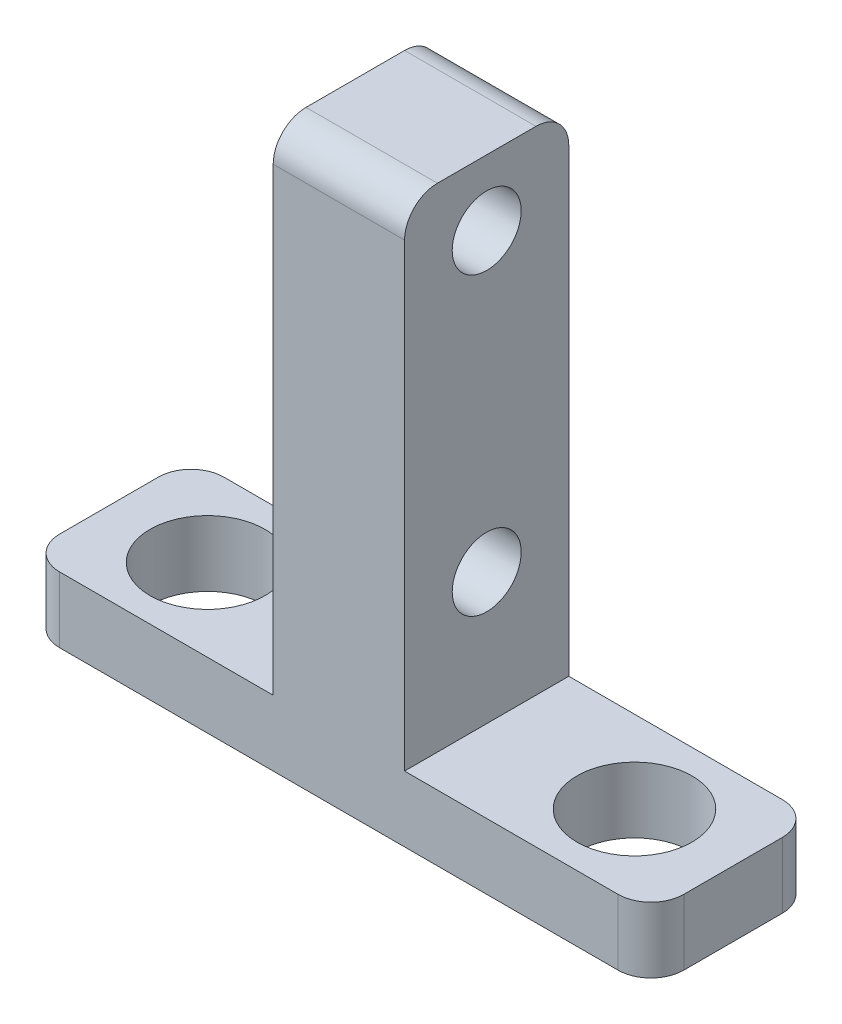
ISO-10303-21;
HEADER;
FILE_DESCRIPTION(('STEP AP214'),'2;1');
FILE_NAME('part.step','',(''),(''),'','','');
FILE_SCHEMA(('AUTOMOTIVE_DESIGN { 1 0 10303 214 1 1 1 1 }'));
ENDSEC;
DATA;
#1=APPLICATION_CONTEXT('core data for automotive mechanical design processes');
#2=APPLICATION_PROTOCOL_DEFINITION('international standard','automotive_design',2000,#1);
#3=PRODUCT_CONTEXT('',#1,'mechanical');
#4=PRODUCT('Part','Part','',(#3));
#5=PRODUCT_RELATED_PRODUCT_CATEGORY('part','',(#4));
#6=PRODUCT_DEFINITION_FORMATION('','',#4);
#7=PRODUCT_DEFINITION_CONTEXT('part definition',#1,'design');
#8=PRODUCT_DEFINITION('design','',#6,#7);
#9=PRODUCT_DEFINITION_SHAPE('','',#8);
#10=(LENGTH_UNIT() NAMED_UNIT(*) SI_UNIT(.MILLI.,.METRE.));
#11=(NAMED_UNIT(*) PLANE_ANGLE_UNIT() SI_UNIT($,.RADIAN.));
#12=(NAMED_UNIT(*) SI_UNIT($,.STERADIAN.) SOLID_ANGLE_UNIT());
#13=UNCERTAINTY_MEASURE_WITH_UNIT(LENGTH_MEASURE(1.E-05),#10,'distance_accuracy_value','');
#14=(GEOMETRIC_REPRESENTATION_CONTEXT(3) GLOBAL_UNCERTAINTY_ASSIGNED_CONTEXT((#13)) GLOBAL_UNIT_ASSIGNED_CONTEXT((#10,
#11,#12)) REPRESENTATION_CONTEXT('',''));
#15=CARTESIAN_POINT('',(0.,0.,0.));
#16=DIRECTION('',(0.,0.,1.));
#17=DIRECTION('',(1.,0.,0.));
#18=AXIS2_PLACEMENT_3D('',#15,#16,#17);
#19=CARTESIAN_POINT('',(0.,2.,0.));
#20=DIRECTION('',(0.,1.,0.));
#21=DIRECTION('',(0.,0.,1.));
#22=AXIS2_PLACEMENT_3D('',#19,#20,#21);
#23=PLANE('',#22);
#24=CARTESIAN_POINT('',(13.,2.,2.5));
#25=DIRECTION('',(0.,1.,0.));
#26=DIRECTION('',(0.,0.,1.));
#27=AXIS2_PLACEMENT_3D('',#24,#25,#26);
#28=CIRCLE('',#27,1.75);
#29=CARTESIAN_POINT('',(13.,2.,4.25));
#30=VERTEX_POINT('',#29);
#31=EDGE_CURVE('E307',#30,#30,#28,.T.);
#32=ORIENTED_EDGE('',*,*,#31,.F.);
#33=EDGE_LOOP('',(#32));
#34=FACE_BOUND('',#33,.T.);
#35=DIRECTION('',(1.,0.,0.));
#36=VECTOR('',#35,1.);
#37=CARTESIAN_POINT('',(-3.,2.,5.));
#38=LINE('',#37,#36);
#39=CARTESIAN_POINT('',(8.5,2.,5.));
#40=VERTEX_POINT('',#39);
#41=CARTESIAN_POINT('',(15.,2.,5.));
#42=VERTEX_POINT('',#41);
#43=EDGE_CURVE('E158',#40,#42,#38,.T.);
#44=ORIENTED_EDGE('',*,*,#43,.T.);
#45=CARTESIAN_POINT('',(15.,2.,4.));
#46=DIRECTION('',(0.,1.,0.));
#47=DIRECTION('',(0.,0.,1.));
#48=AXIS2_PLACEMENT_3D('',#45,#46,#47);
#49=CIRCLE('',#48,1.);
#50=CARTESIAN_POINT('',(16.,2.,4.));
#51=VERTEX_POINT('',#50);
#52=EDGE_CURVE('E237',#42,#51,#49,.T.);
#53=ORIENTED_EDGE('',*,*,#52,.T.);
#54=DIRECTION('',(0.,0.,-1.));
#55=VECTOR('',#54,1.);
#56=CARTESIAN_POINT('',(16.,2.,0.));
#57=LINE('',#56,#55);
#58=CARTESIAN_POINT('',(16.,2.,1.));
#59=VERTEX_POINT('',#58);
#60=EDGE_CURVE('E157',#51,#59,#57,.T.);
#61=ORIENTED_EDGE('',*,*,#60,.T.);
#62=CARTESIAN_POINT('',(15.,2.,1.));
#63=DIRECTION('',(0.,1.,0.));
#64=DIRECTION('',(0.,0.,1.));
#65=AXIS2_PLACEMENT_3D('',#62,#63,#64);
#66=CIRCLE('',#65,1.);
#67=CARTESIAN_POINT('',(15.,2.,0.));
#68=VERTEX_POINT('',#67);
#69=EDGE_CURVE('E235',#59,#68,#66,.T.);
#70=ORIENTED_EDGE('',*,*,#69,.T.);
#71=DIRECTION('',(-1.,0.,0.));
#72=VECTOR('',#71,1.);
#73=CARTESIAN_POINT('',(0.,2.,0.));
#74=LINE('',#73,#72);
#75=CARTESIAN_POINT('',(8.5,2.,0.));
#76=VERTEX_POINT('',#75);
#77=EDGE_CURVE('E178',#68,#76,#74,.T.);
#78=ORIENTED_EDGE('',*,*,#77,.T.);
#79=DIRECTION('',(0.,0.,-1.));
#80=VECTOR('',#79,1.);
#81=CARTESIAN_POINT('',(8.5,2.,0.));
#82=LINE('',#81,#80);
#83=EDGE_CURVE('E163',#40,#76,#82,.T.);
#84=ORIENTED_EDGE('',*,*,#83,.F.);
#85=EDGE_LOOP('',(#44,#53,#61,#70,#78,#84));
#86=FACE_BOUND('',#85,.T.);
#87=ADVANCED_FACE('F34',(#34,#86),#23,.T.);
#88=CARTESIAN_POINT('',(-3.,2.,0.));
#89=DIRECTION('',(1.,0.,0.));
#90=DIRECTION('',(0.,0.,-1.));
#91=AXIS2_PLACEMENT_3D('',#88,#89,#90);
#92=PLANE('',#91);
#93=DIRECTION('',(0.,0.,1.));
#94=VECTOR('',#93,1.);
#95=CARTESIAN_POINT('',(-3.,2.,0.));
#96=LINE('',#95,#94);
#97=CARTESIAN_POINT('',(-3.,2.,1.));
#98=VERTEX_POINT('',#97);
#99=CARTESIAN_POINT('',(-3.,2.,4.));
#100=VERTEX_POINT('',#99);
#101=EDGE_CURVE('E181',#98,#100,#96,.T.);
#102=ORIENTED_EDGE('',*,*,#101,.F.);
#103=DIRECTION('',(0.,-1.,0.));
#104=VECTOR('',#103,1.);
#105=CARTESIAN_POINT('',(-3.,2.,1.));
#106=LINE('',#105,#104);
#107=CARTESIAN_POINT('',(-3.,0.,1.));
#108=VERTEX_POINT('',#107);
#109=EDGE_CURVE('E207',#98,#108,#106,.T.);
#110=ORIENTED_EDGE('',*,*,#109,.T.);
#111=DIRECTION('',(0.,0.,1.));
#112=VECTOR('',#111,1.);
#113=CARTESIAN_POINT('',(-3.,0.,0.));
#114=LINE('',#113,#112);
#115=CARTESIAN_POINT('',(-3.,0.,4.));
#116=VERTEX_POINT('',#115);
#117=EDGE_CURVE('E177',#108,#116,#114,.T.);
#118=ORIENTED_EDGE('',*,*,#117,.T.);
#119=DIRECTION('',(0.,-1.,0.));
#120=VECTOR('',#119,1.);
#121=CARTESIAN_POINT('',(-3.,2.,4.));
#122=LINE('',#121,#120);
#123=EDGE_CURVE('E186',#116,#100,#122,.F.);
#124=ORIENTED_EDGE('',*,*,#123,.T.);
#125=EDGE_LOOP('',(#102,#110,#118,#124));
#126=FACE_BOUND('',#125,.T.);
#127=ADVANCED_FACE('F268',(#126),#92,.F.);
#128=CARTESIAN_POINT('',(16.,2.,5.));
#129=DIRECTION('',(0.,0.,-1.));
#130=DIRECTION('',(-1.,0.,0.));
#131=AXIS2_PLACEMENT_3D('',#128,#129,#130);
#132=PLANE('',#131);
#133=DIRECTION('',(0.,-1.,0.));
#134=VECTOR('',#133,1.);
#135=CARTESIAN_POINT('',(8.5,17.,5.));
#136=LINE('',#135,#134);
#137=CARTESIAN_POINT('',(8.5,16.,5.));
#138=VERTEX_POINT('',#137);
#139=EDGE_CURVE('E146',#138,#40,#136,.T.);
#140=ORIENTED_EDGE('',*,*,#139,.F.);
#141=DIRECTION('',(1.,0.,0.));
#142=VECTOR('',#141,1.);
#143=CARTESIAN_POINT('',(4.5,16.,5.));
#144=LINE('',#143,#142);
#145=CARTESIAN_POINT('',(4.5,16.,5.));
#146=VERTEX_POINT('',#145);
#147=EDGE_CURVE('E11',#138,#146,#144,.F.);
#148=ORIENTED_EDGE('',*,*,#147,.T.);
#149=DIRECTION('',(0.,-1.,0.));
#150=VECTOR('',#149,1.);
#151=CARTESIAN_POINT('',(4.5,17.,5.));
#152=LINE('',#151,#150);
#153=CARTESIAN_POINT('',(4.5,2.,5.));
#154=VERTEX_POINT('',#153);
#155=EDGE_CURVE('E135',#146,#154,#152,.T.);
#156=ORIENTED_EDGE('',*,*,#155,.T.);
#157=CARTESIAN_POINT('',(-2.,2.,5.));
#158=VERTEX_POINT('',#157);
#159=EDGE_CURVE('E139',#158,#154,#38,.T.);
#160=ORIENTED_EDGE('',*,*,#159,.F.);
#161=DIRECTION('',(0.,-1.,0.));
#162=VECTOR('',#161,1.);
#163=CARTESIAN_POINT('',(-2.,2.,5.));
#164=LINE('',#163,#162);
#165=CARTESIAN_POINT('',(-2.,0.,5.));
#166=VERTEX_POINT('',#165);
#167=EDGE_CURVE('E228',#158,#166,#164,.T.);
#168=ORIENTED_EDGE('',*,*,#167,.T.);
#169=DIRECTION('',(1.,0.,0.));
#170=VECTOR('',#169,1.);
#171=CARTESIAN_POINT('',(16.,0.,5.));
#172=LINE('',#171,#170);
#173=CARTESIAN_POINT('',(15.,0.,5.));
#174=VERTEX_POINT('',#173);
#175=EDGE_CURVE('E189',#166,#174,#172,.T.);
#176=ORIENTED_EDGE('',*,*,#175,.T.);
#177=DIRECTION('',(0.,-1.,0.));
#178=VECTOR('',#177,1.);
#179=CARTESIAN_POINT('',(15.,2.,5.));
#180=LINE('',#179,#178);
#181=EDGE_CURVE('E226',#174,#42,#180,.F.);
#182=ORIENTED_EDGE('',*,*,#181,.T.);
#183=ORIENTED_EDGE('',*,*,#43,.F.);
#184=EDGE_LOOP('',(#140,#148,#156,#160,#168,#176,#182,#183));
#185=FACE_BOUND('',#184,.T.);
#186=ADVANCED_FACE('F137',(#185),#132,.F.);
#187=CARTESIAN_POINT('',(16.,2.,0.));
#188=DIRECTION('',(-1.,0.,0.));
#189=DIRECTION('',(0.,0.,1.));
#190=AXIS2_PLACEMENT_3D('',#187,#188,#189);
#191=PLANE('',#190);
#192=ORIENTED_EDGE('',*,*,#60,.F.);
#193=DIRECTION('',(0.,-1.,0.));
#194=VECTOR('',#193,1.);
#195=CARTESIAN_POINT('',(16.,2.,4.));
#196=LINE('',#195,#194);
#197=CARTESIAN_POINT('',(16.,0.,4.));
#198=VERTEX_POINT('',#197);
#199=EDGE_CURVE('E232',#51,#198,#196,.T.);
#200=ORIENTED_EDGE('',*,*,#199,.T.);
#201=DIRECTION('',(0.,0.,-1.));
#202=VECTOR('',#201,1.);
#203=CARTESIAN_POINT('',(16.,0.,0.));
#204=LINE('',#203,#202);
#205=CARTESIAN_POINT('',(16.,0.,1.));
#206=VERTEX_POINT('',#205);
#207=EDGE_CURVE('E192',#198,#206,#204,.T.);
#208=ORIENTED_EDGE('',*,*,#207,.T.);
#209=DIRECTION('',(0.,-1.,0.));
#210=VECTOR('',#209,1.);
#211=CARTESIAN_POINT('',(16.,2.,1.));
#212=LINE('',#211,#210);
#213=EDGE_CURVE('E230',#206,#59,#212,.F.);
#214=ORIENTED_EDGE('',*,*,#213,.T.);
#215=EDGE_LOOP('',(#192,#200,#208,#214));
#216=FACE_BOUND('',#215,.T.);
#217=ADVANCED_FACE('F288',(#216),#191,.F.);
#218=CARTESIAN_POINT('',(13.,2.,0.));
#219=DIRECTION('',(0.,0.,1.));
#220=DIRECTION('',(1.,0.,0.));
#221=AXIS2_PLACEMENT_3D('',#218,#219,#220);
#222=PLANE('',#221);
#223=DIRECTION('',(0.,-1.,0.));
#224=VECTOR('',#223,1.);
#225=CARTESIAN_POINT('',(4.5,17.,0.));
#226=LINE('',#225,#224);
#227=CARTESIAN_POINT('',(4.5,16.,0.));
#228=VERTEX_POINT('',#227);
#229=CARTESIAN_POINT('',(4.5,2.,0.));
#230=VERTEX_POINT('',#229);
#231=EDGE_CURVE('E145',#228,#230,#226,.T.);
#232=ORIENTED_EDGE('',*,*,#231,.F.);
#233=DIRECTION('',(-1.,0.,0.));
#234=VECTOR('',#233,1.);
#235=CARTESIAN_POINT('',(8.5,16.,0.));
#236=LINE('',#235,#234);
#237=CARTESIAN_POINT('',(8.5,16.,0.));
#238=VERTEX_POINT('',#237);
#239=EDGE_CURVE('E57',#228,#238,#236,.F.);
#240=ORIENTED_EDGE('',*,*,#239,.T.);
#241=DIRECTION('',(0.,-1.,0.));
#242=VECTOR('',#241,1.);
#243=CARTESIAN_POINT('',(8.5,17.,0.));
#244=LINE('',#243,#242);
#245=EDGE_CURVE('E175',#238,#76,#244,.T.);
#246=ORIENTED_EDGE('',*,*,#245,.T.);
#247=ORIENTED_EDGE('',*,*,#77,.F.);
#248=DIRECTION('',(0.,-1.,0.));
#249=VECTOR('',#248,1.);
#250=CARTESIAN_POINT('',(15.,2.,0.));
#251=LINE('',#250,#249);
#252=CARTESIAN_POINT('',(15.,0.,0.));
#253=VERTEX_POINT('',#252);
#254=EDGE_CURVE('E218',#68,#253,#251,.T.);
#255=ORIENTED_EDGE('',*,*,#254,.T.);
#256=DIRECTION('',(-1.,0.,0.));
#257=VECTOR('',#256,1.);
#258=CARTESIAN_POINT('',(13.,0.,0.));
#259=LINE('',#258,#257);
#260=CARTESIAN_POINT('',(-2.,0.,0.));
#261=VERTEX_POINT('',#260);
#262=EDGE_CURVE('E195',#253,#261,#259,.T.);
#263=ORIENTED_EDGE('',*,*,#262,.T.);
#264=DIRECTION('',(0.,-1.,0.));
#265=VECTOR('',#264,1.);
#266=CARTESIAN_POINT('',(-2.,2.,0.));
#267=LINE('',#266,#265);
#268=CARTESIAN_POINT('',(-2.,2.,0.));
#269=VERTEX_POINT('',#268);
#270=EDGE_CURVE('E221',#261,#269,#267,.F.);
#271=ORIENTED_EDGE('',*,*,#270,.T.);
#272=EDGE_CURVE('E182',#230,#269,#74,.T.);
#273=ORIENTED_EDGE('',*,*,#272,.F.);
#274=EDGE_LOOP('',(#232,#240,#246,#247,#255,#263,#271,#273));
#275=FACE_BOUND('',#274,.T.);
#276=ADVANCED_FACE('F259',(#275),#222,.F.);
#277=CARTESIAN_POINT('',(0.,2.,2.5));
#278=DIRECTION('',(0.,1.,0.));
#279=DIRECTION('',(0.,0.,1.));
#280=AXIS2_PLACEMENT_3D('',#277,#278,#279);
#281=CIRCLE('',#280,1.75);
#282=CARTESIAN_POINT('',(0.,2.,4.25));
#283=VERTEX_POINT('',#282);
#284=EDGE_CURVE('E202',#283,#283,#281,.T.);
#285=ORIENTED_EDGE('',*,*,#284,.F.);
#286=EDGE_LOOP('',(#285));
#287=FACE_BOUND('',#286,.T.);
#288=ORIENTED_EDGE('',*,*,#272,.T.);
#289=CARTESIAN_POINT('',(-2.,2.,1.));
#290=DIRECTION('',(0.,1.,0.));
#291=DIRECTION('',(0.,0.,1.));
#292=AXIS2_PLACEMENT_3D('',#289,#290,#291);
#293=CIRCLE('',#292,1.);
#294=EDGE_CURVE('E224',#269,#98,#293,.T.);
#295=ORIENTED_EDGE('',*,*,#294,.T.);
#296=ORIENTED_EDGE('',*,*,#101,.T.);
#297=CARTESIAN_POINT('',(-2.,2.,4.));
#298=DIRECTION('',(0.,1.,0.));
#299=DIRECTION('',(0.,0.,1.));
#300=AXIS2_PLACEMENT_3D('',#297,#298,#299);
#301=CIRCLE('',#300,1.);
#302=EDGE_CURVE('E156',#100,#158,#301,.T.);
#303=ORIENTED_EDGE('',*,*,#302,.T.);
#304=ORIENTED_EDGE('',*,*,#159,.T.);
#305=DIRECTION('',(0.,0.,1.));
#306=VECTOR('',#305,1.);
#307=CARTESIAN_POINT('',(4.5,2.,0.));
#308=LINE('',#307,#306);
#309=EDGE_CURVE('E152',#230,#154,#308,.T.);
#310=ORIENTED_EDGE('',*,*,#309,.F.);
#311=EDGE_LOOP('',(#288,#295,#296,#303,#304,#310));
#312=FACE_BOUND('',#311,.T.);
#313=ADVANCED_FACE('F151',(#287,#312),#23,.T.);
#314=CARTESIAN_POINT('',(0.,0.,0.));
#315=DIRECTION('',(0.,1.,0.));
#316=DIRECTION('',(0.,0.,1.));
#317=AXIS2_PLACEMENT_3D('',#314,#315,#316);
#318=PLANE('',#317);
#319=CARTESIAN_POINT('',(0.,0.,2.5));
#320=DIRECTION('',(0.,1.,0.));
#321=DIRECTION('',(0.,0.,1.));
#322=AXIS2_PLACEMENT_3D('',#319,#320,#321);
#323=CIRCLE('',#322,1.75);
#324=CARTESIAN_POINT('',(0.,0.,4.25));
#325=VERTEX_POINT('',#324);
#326=EDGE_CURVE('E201',#325,#325,#323,.T.);
#327=ORIENTED_EDGE('',*,*,#326,.T.);
#328=EDGE_LOOP('',(#327));
#329=FACE_BOUND('',#328,.T.);
#330=CARTESIAN_POINT('',(13.,0.,2.5));
#331=DIRECTION('',(0.,1.,0.));
#332=DIRECTION('',(0.,0.,1.));
#333=AXIS2_PLACEMENT_3D('',#330,#331,#332);
#334=CIRCLE('',#333,1.75);
#335=CARTESIAN_POINT('',(13.,0.,4.25));
#336=VERTEX_POINT('',#335);
#337=EDGE_CURVE('E198',#336,#336,#334,.T.);
#338=ORIENTED_EDGE('',*,*,#337,.T.);
#339=EDGE_LOOP('',(#338));
#340=FACE_BOUND('',#339,.T.);
#341=ORIENTED_EDGE('',*,*,#117,.F.);
#342=CARTESIAN_POINT('',(-2.,0.,1.));
#343=DIRECTION('',(0.,1.,0.));
#344=DIRECTION('',(0.,0.,1.));
#345=AXIS2_PLACEMENT_3D('',#342,#343,#344);
#346=CIRCLE('',#345,1.);
#347=EDGE_CURVE('E216',#108,#261,#346,.F.);
#348=ORIENTED_EDGE('',*,*,#347,.T.);
#349=ORIENTED_EDGE('',*,*,#262,.F.);
#350=CARTESIAN_POINT('',(15.,0.,1.));
#351=DIRECTION('',(0.,1.,0.));
#352=DIRECTION('',(0.,0.,1.));
#353=AXIS2_PLACEMENT_3D('',#350,#351,#352);
#354=CIRCLE('',#353,1.);
#355=EDGE_CURVE('E210',#253,#206,#354,.F.);
#356=ORIENTED_EDGE('',*,*,#355,.T.);
#357=ORIENTED_EDGE('',*,*,#207,.F.);
#358=CARTESIAN_POINT('',(15.,0.,4.));
#359=DIRECTION('',(0.,1.,0.));
#360=DIRECTION('',(0.,0.,1.));
#361=AXIS2_PLACEMENT_3D('',#358,#359,#360);
#362=CIRCLE('',#361,1.);
#363=EDGE_CURVE('E212',#198,#174,#362,.F.);
#364=ORIENTED_EDGE('',*,*,#363,.T.);
#365=ORIENTED_EDGE('',*,*,#175,.F.);
#366=CARTESIAN_POINT('',(-2.,0.,4.));
#367=DIRECTION('',(0.,1.,0.));
#368=DIRECTION('',(0.,0.,1.));
#369=AXIS2_PLACEMENT_3D('',#366,#367,#368);
#370=CIRCLE('',#369,1.);
#371=EDGE_CURVE('E214',#166,#116,#370,.F.);
#372=ORIENTED_EDGE('',*,*,#371,.T.);
#373=EDGE_LOOP('',(#341,#348,#349,#356,#357,#364,#365,#372));
#374=FACE_BOUND('',#373,.T.);
#375=ADVANCED_FACE('F271',(#329,#340,#374),#318,.F.);
#376=CARTESIAN_POINT('',(8.5,17.,0.));
#377=DIRECTION('',(-1.,0.,0.));
#378=DIRECTION('',(0.,0.,1.));
#379=AXIS2_PLACEMENT_3D('',#376,#377,#378);
#380=PLANE('',#379);
#381=CARTESIAN_POINT('',(8.5,15.,2.5));
#382=DIRECTION('',(-1.,0.,0.));
#383=DIRECTION('',(0.,0.,1.));
#384=AXIS2_PLACEMENT_3D('',#381,#382,#383);
#385=CIRCLE('',#384,1.05);
#386=CARTESIAN_POINT('',(8.5,15.,3.55));
#387=VERTEX_POINT('',#386);
#388=EDGE_CURVE('E169',#387,#387,#385,.T.);
#389=ORIENTED_EDGE('',*,*,#388,.T.);
#390=EDGE_LOOP('',(#389));
#391=FACE_BOUND('',#390,.T.);
#392=CARTESIAN_POINT('',(8.5,6.,2.5));
#393=DIRECTION('',(-1.,0.,0.));
#394=DIRECTION('',(0.,0.,1.));
#395=AXIS2_PLACEMENT_3D('',#392,#393,#394);
#396=CIRCLE('',#395,1.05);
#397=CARTESIAN_POINT('',(8.5,6.,3.55));
#398=VERTEX_POINT('',#397);
#399=EDGE_CURVE('E299',#398,#398,#396,.T.);
#400=ORIENTED_EDGE('',*,*,#399,.T.);
#401=EDGE_LOOP('',(#400));
#402=FACE_BOUND('',#401,.T.);
#403=ORIENTED_EDGE('',*,*,#245,.F.);
#404=CARTESIAN_POINT('',(8.5,16.,1.));
#405=DIRECTION('',(-1.,0.,0.));
#406=DIRECTION('',(0.,0.,1.));
#407=AXIS2_PLACEMENT_3D('',#404,#405,#406);
#408=CIRCLE('',#407,1.);
#409=CARTESIAN_POINT('',(8.5,17.,1.));
#410=VERTEX_POINT('',#409);
#411=EDGE_CURVE('E42',#238,#410,#408,.F.);
#412=ORIENTED_EDGE('',*,*,#411,.T.);
#413=DIRECTION('',(0.,0.,-1.));
#414=VECTOR('',#413,1.);
#415=CARTESIAN_POINT('',(8.5,17.,0.));
#416=LINE('',#415,#414);
#417=CARTESIAN_POINT('',(8.5,17.,4.));
#418=VERTEX_POINT('',#417);
#419=EDGE_CURVE('E162',#418,#410,#416,.T.);
#420=ORIENTED_EDGE('',*,*,#419,.F.);
#421=CARTESIAN_POINT('',(8.5,16.,4.));
#422=DIRECTION('',(-1.,0.,0.));
#423=DIRECTION('',(0.,0.,1.));
#424=AXIS2_PLACEMENT_3D('',#421,#422,#423);
#425=CIRCLE('',#424,1.);
#426=EDGE_CURVE('E49',#418,#138,#425,.F.);
#427=ORIENTED_EDGE('',*,*,#426,.T.);
#428=ORIENTED_EDGE('',*,*,#139,.T.);
#429=ORIENTED_EDGE('',*,*,#83,.T.);
#430=EDGE_LOOP('',(#403,#412,#420,#427,#428,#429));
#431=FACE_BOUND('',#430,.T.);
#432=ADVANCED_FACE('F251',(#391,#402,#431),#380,.F.);
#433=CARTESIAN_POINT('',(4.5,17.,0.));
#434=DIRECTION('',(1.,0.,0.));
#435=DIRECTION('',(0.,0.,-1.));
#436=AXIS2_PLACEMENT_3D('',#433,#434,#435);
#437=PLANE('',#436);
#438=CARTESIAN_POINT('',(4.5,15.,2.5));
#439=DIRECTION('',(-1.,0.,0.));
#440=DIRECTION('',(0.,0.,1.));
#441=AXIS2_PLACEMENT_3D('',#438,#439,#440);
#442=CIRCLE('',#441,1.05);
#443=CARTESIAN_POINT('',(4.5,15.,3.55));
#444=VERTEX_POINT('',#443);
#445=EDGE_CURVE('E302',#444,#444,#442,.T.);
#446=ORIENTED_EDGE('',*,*,#445,.F.);
#447=EDGE_LOOP('',(#446));
#448=FACE_BOUND('',#447,.T.);
#449=CARTESIAN_POINT('',(4.5,6.,2.5));
#450=DIRECTION('',(-1.,0.,0.));
#451=DIRECTION('',(0.,0.,1.));
#452=AXIS2_PLACEMENT_3D('',#449,#450,#451);
#453=CIRCLE('',#452,1.05);
#454=CARTESIAN_POINT('',(4.5,6.,3.55));
#455=VERTEX_POINT('',#454);
#456=EDGE_CURVE('E205',#455,#455,#453,.T.);
#457=ORIENTED_EDGE('',*,*,#456,.F.);
#458=EDGE_LOOP('',(#457));
#459=FACE_BOUND('',#458,.T.);
#460=DIRECTION('',(0.,0.,1.));
#461=VECTOR('',#460,1.);
#462=CARTESIAN_POINT('',(4.5,17.,0.));
#463=LINE('',#462,#461);
#464=CARTESIAN_POINT('',(4.5,17.,1.));
#465=VERTEX_POINT('',#464);
#466=CARTESIAN_POINT('',(4.5,17.,4.));
#467=VERTEX_POINT('',#466);
#468=EDGE_CURVE('E166',#465,#467,#463,.T.);
#469=ORIENTED_EDGE('',*,*,#468,.F.);
#470=CARTESIAN_POINT('',(4.5,16.,1.));
#471=DIRECTION('',(1.,0.,0.));
#472=DIRECTION('',(0.,0.,-1.));
#473=AXIS2_PLACEMENT_3D('',#470,#471,#472);
#474=CIRCLE('',#473,1.);
#475=EDGE_CURVE('E247',#465,#228,#474,.F.);
#476=ORIENTED_EDGE('',*,*,#475,.T.);
#477=ORIENTED_EDGE('',*,*,#231,.T.);
#478=ORIENTED_EDGE('',*,*,#309,.T.);
#479=ORIENTED_EDGE('',*,*,#155,.F.);
#480=CARTESIAN_POINT('',(4.5,16.,4.));
#481=DIRECTION('',(1.,0.,0.));
#482=DIRECTION('',(0.,0.,-1.));
#483=AXIS2_PLACEMENT_3D('',#480,#481,#482);
#484=CIRCLE('',#483,1.);
#485=EDGE_CURVE('E245',#146,#467,#484,.F.);
#486=ORIENTED_EDGE('',*,*,#485,.T.);
#487=EDGE_LOOP('',(#469,#476,#477,#478,#479,#486));
#488=FACE_BOUND('',#487,.T.);
#489=ADVANCED_FACE('F161',(#448,#459,#488),#437,.F.);
#490=CARTESIAN_POINT('',(0.,17.,0.));
#491=DIRECTION('',(0.,1.,0.));
#492=DIRECTION('',(0.,0.,1.));
#493=AXIS2_PLACEMENT_3D('',#490,#491,#492);
#494=PLANE('',#493);
#495=ORIENTED_EDGE('',*,*,#419,.T.);
#496=DIRECTION('',(-1.,0.,0.));
#497=VECTOR('',#496,1.);
#498=CARTESIAN_POINT('',(4.5,17.,1.));
#499=LINE('',#498,#497);
#500=EDGE_CURVE('E242',#410,#465,#499,.T.);
#501=ORIENTED_EDGE('',*,*,#500,.T.);
#502=ORIENTED_EDGE('',*,*,#468,.T.);
#503=DIRECTION('',(1.,0.,0.));
#504=VECTOR('',#503,1.);
#505=CARTESIAN_POINT('',(8.5,17.,4.));
#506=LINE('',#505,#504);
#507=EDGE_CURVE('E239',#467,#418,#506,.T.);
#508=ORIENTED_EDGE('',*,*,#507,.T.);
#509=EDGE_LOOP('',(#495,#501,#502,#508));
#510=FACE_BOUND('',#509,.T.);
#511=ADVANCED_FACE('F255',(#510),#494,.T.);
#512=CARTESIAN_POINT('',(16.5,6.,2.5));
#513=DIRECTION('',(-1.,0.,0.));
#514=DIRECTION('',(0.,0.,1.));
#515=AXIS2_PLACEMENT_3D('',#512,#513,#514);
#516=CYLINDRICAL_SURFACE('',#515,1.05);
#517=ORIENTED_EDGE('',*,*,#456,.T.);
#518=EDGE_LOOP('',(#517));
#519=FACE_BOUND('',#518,.T.);
#520=ORIENTED_EDGE('',*,*,#399,.F.);
#521=EDGE_LOOP('',(#520));
#522=FACE_BOUND('',#521,.T.);
#523=ADVANCED_FACE('F346',(#519,#522),#516,.F.);
#524=CARTESIAN_POINT('',(16.5,15.,2.5));
#525=DIRECTION('',(-1.,0.,0.));
#526=DIRECTION('',(0.,0.,1.));
#527=AXIS2_PLACEMENT_3D('',#524,#525,#526);
#528=CYLINDRICAL_SURFACE('',#527,1.05);
#529=ORIENTED_EDGE('',*,*,#445,.T.);
#530=EDGE_LOOP('',(#529));
#531=FACE_BOUND('',#530,.T.);
#532=ORIENTED_EDGE('',*,*,#388,.F.);
#533=EDGE_LOOP('',(#532));
#534=FACE_BOUND('',#533,.T.);
#535=ADVANCED_FACE('F337',(#531,#534),#528,.F.);
#536=CARTESIAN_POINT('',(13.,-10.,2.5));
#537=DIRECTION('',(0.,1.,0.));
#538=DIRECTION('',(0.,0.,1.));
#539=AXIS2_PLACEMENT_3D('',#536,#537,#538);
#540=CYLINDRICAL_SURFACE('',#539,1.75);
#541=ORIENTED_EDGE('',*,*,#31,.T.);
#542=EDGE_LOOP('',(#541));
#543=FACE_BOUND('',#542,.T.);
#544=ORIENTED_EDGE('',*,*,#337,.F.);
#545=EDGE_LOOP('',(#544));
#546=FACE_BOUND('',#545,.T.);
#547=ADVANCED_FACE('F334',(#543,#546),#540,.F.);
#548=CARTESIAN_POINT('',(0.,-10.,2.5));
#549=DIRECTION('',(0.,1.,0.));
#550=DIRECTION('',(0.,0.,1.));
#551=AXIS2_PLACEMENT_3D('',#548,#549,#550);
#552=CYLINDRICAL_SURFACE('',#551,1.75);
#553=ORIENTED_EDGE('',*,*,#284,.T.);
#554=EDGE_LOOP('',(#553));
#555=FACE_BOUND('',#554,.T.);
#556=ORIENTED_EDGE('',*,*,#326,.F.);
#557=EDGE_LOOP('',(#556));
#558=FACE_BOUND('',#557,.T.);
#559=ADVANCED_FACE('F313',(#555,#558),#552,.F.);
#560=CARTESIAN_POINT('',(-2.,2.,1.));
#561=DIRECTION('',(0.,-1.,0.));
#562=DIRECTION('',(0.,0.,-1.));
#563=AXIS2_PLACEMENT_3D('',#560,#561,#562);
#564=CYLINDRICAL_SURFACE('',#563,1.);
#565=ORIENTED_EDGE('',*,*,#294,.F.);
#566=ORIENTED_EDGE('',*,*,#270,.F.);
#567=ORIENTED_EDGE('',*,*,#347,.F.);
#568=ORIENTED_EDGE('',*,*,#109,.F.);
#569=EDGE_LOOP('',(#565,#566,#567,#568));
#570=FACE_BOUND('',#569,.T.);
#571=ADVANCED_FACE('F265',(#570),#564,.T.);
#572=CARTESIAN_POINT('',(-2.,2.,4.));
#573=DIRECTION('',(0.,-1.,0.));
#574=DIRECTION('',(0.,0.,-1.));
#575=AXIS2_PLACEMENT_3D('',#572,#573,#574);
#576=CYLINDRICAL_SURFACE('',#575,1.);
#577=ORIENTED_EDGE('',*,*,#302,.F.);
#578=ORIENTED_EDGE('',*,*,#123,.F.);
#579=ORIENTED_EDGE('',*,*,#371,.F.);
#580=ORIENTED_EDGE('',*,*,#167,.F.);
#581=EDGE_LOOP('',(#577,#578,#579,#580));
#582=FACE_BOUND('',#581,.T.);
#583=ADVANCED_FACE('F275',(#582),#576,.T.);
#584=CARTESIAN_POINT('',(15.,2.,4.));
#585=DIRECTION('',(0.,-1.,0.));
#586=DIRECTION('',(0.,0.,-1.));
#587=AXIS2_PLACEMENT_3D('',#584,#585,#586);
#588=CYLINDRICAL_SURFACE('',#587,1.);
#589=ORIENTED_EDGE('',*,*,#52,.F.);
#590=ORIENTED_EDGE('',*,*,#181,.F.);
#591=ORIENTED_EDGE('',*,*,#363,.F.);
#592=ORIENTED_EDGE('',*,*,#199,.F.);
#593=EDGE_LOOP('',(#589,#590,#591,#592));
#594=FACE_BOUND('',#593,.T.);
#595=ADVANCED_FACE('F281',(#594),#588,.T.);
#596=CARTESIAN_POINT('',(15.,2.,1.));
#597=DIRECTION('',(0.,-1.,0.));
#598=DIRECTION('',(0.,0.,-1.));
#599=AXIS2_PLACEMENT_3D('',#596,#597,#598);
#600=CYLINDRICAL_SURFACE('',#599,1.);
#601=ORIENTED_EDGE('',*,*,#69,.F.);
#602=ORIENTED_EDGE('',*,*,#213,.F.);
#603=ORIENTED_EDGE('',*,*,#355,.F.);
#604=ORIENTED_EDGE('',*,*,#254,.F.);
#605=EDGE_LOOP('',(#601,#602,#603,#604));
#606=FACE_BOUND('',#605,.T.);
#607=ADVANCED_FACE('F292',(#606),#600,.T.);
#608=CARTESIAN_POINT('',(0.,16.,1.));
#609=DIRECTION('',(1.,0.,0.));
#610=DIRECTION('',(0.,0.,-1.));
#611=AXIS2_PLACEMENT_3D('',#608,#609,#610);
#612=CYLINDRICAL_SURFACE('',#611,1.);
#613=ORIENTED_EDGE('',*,*,#411,.F.);
#614=ORIENTED_EDGE('',*,*,#239,.F.);
#615=ORIENTED_EDGE('',*,*,#475,.F.);
#616=ORIENTED_EDGE('',*,*,#500,.F.);
#617=EDGE_LOOP('',(#613,#614,#615,#616));
#618=FACE_BOUND('',#617,.T.);
#619=ADVANCED_FACE('F258',(#618),#612,.T.);
#620=CARTESIAN_POINT('',(0.,16.,4.));
#621=DIRECTION('',(-1.,0.,0.));
#622=DIRECTION('',(0.,0.,1.));
#623=AXIS2_PLACEMENT_3D('',#620,#621,#622);
#624=CYLINDRICAL_SURFACE('',#623,1.);
#625=ORIENTED_EDGE('',*,*,#485,.F.);
#626=ORIENTED_EDGE('',*,*,#147,.F.);
#627=ORIENTED_EDGE('',*,*,#426,.F.);
#628=ORIENTED_EDGE('',*,*,#507,.F.);
#629=EDGE_LOOP('',(#625,#626,#627,#628));
#630=FACE_BOUND('',#629,.T.);
#631=ADVANCED_FACE('F36',(#630),#624,.T.);
#632=CLOSED_SHELL('',(#87,#127,#186,#217,#276,#313,#375,#432,#489,#511,#523,#535,#547,#559,#571,
#583,#595,#607,#619,#631));
#633=MANIFOLD_SOLID_BREP('B2',#632);
#634=ADVANCED_BREP_SHAPE_REPRESENTATION('',(#18,#633),#14);
#635=SHAPE_DEFINITION_REPRESENTATION(#9,#634);
ENDSEC;
END-ISO-10303-21;
